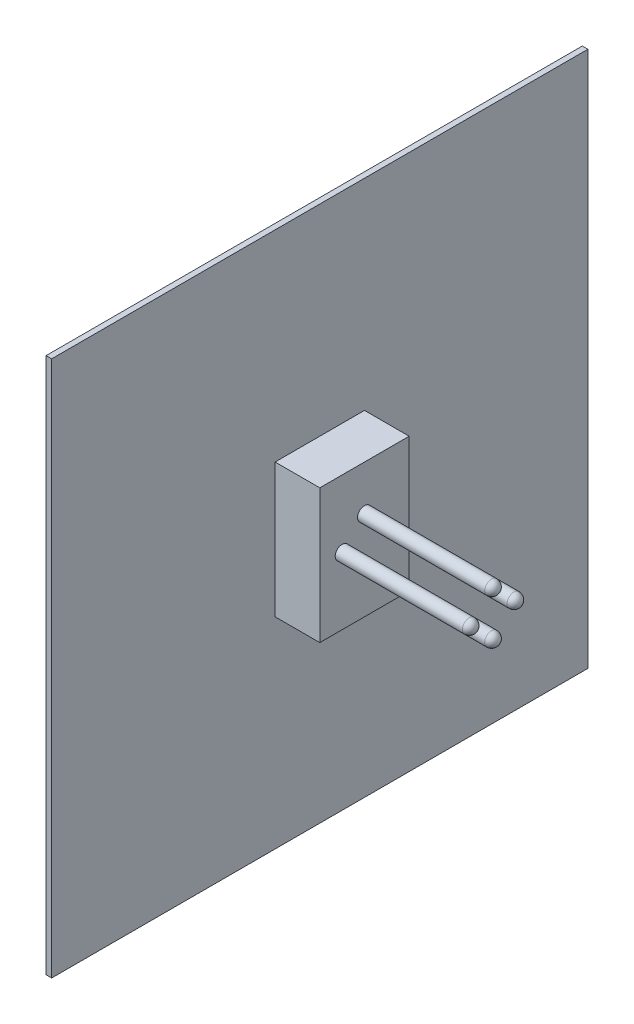
ISO-10303-21;
HEADER;
FILE_DESCRIPTION(('STEP AP214'),'2;1');
FILE_NAME('part.step','',(''),(''),'','','');
FILE_SCHEMA(('AUTOMOTIVE_DESIGN { 1 0 10303 214 1 1 1 1 }'));
ENDSEC;
DATA;
#1=APPLICATION_CONTEXT('core data for automotive mechanical design processes');
#2=APPLICATION_PROTOCOL_DEFINITION('international standard','automotive_design',2000,#1);
#3=PRODUCT_CONTEXT('',#1,'mechanical');
#4=PRODUCT('Part','Part','',(#3));
#5=PRODUCT_RELATED_PRODUCT_CATEGORY('part','',(#4));
#6=PRODUCT_DEFINITION_FORMATION('','',#4);
#7=PRODUCT_DEFINITION_CONTEXT('part definition',#1,'design');
#8=PRODUCT_DEFINITION('design','',#6,#7);
#9=PRODUCT_DEFINITION_SHAPE('','',#8);
#10=(LENGTH_UNIT() NAMED_UNIT(*) SI_UNIT(.MILLI.,.METRE.));
#11=(NAMED_UNIT(*) PLANE_ANGLE_UNIT() SI_UNIT($,.RADIAN.));
#12=(NAMED_UNIT(*) SI_UNIT($,.STERADIAN.) SOLID_ANGLE_UNIT());
#13=UNCERTAINTY_MEASURE_WITH_UNIT(LENGTH_MEASURE(1.E-05),#10,'distance_accuracy_value','');
#14=(GEOMETRIC_REPRESENTATION_CONTEXT(3) GLOBAL_UNCERTAINTY_ASSIGNED_CONTEXT((#13)) GLOBAL_UNIT_ASSIGNED_CONTEXT((#10,
#11,#12)) REPRESENTATION_CONTEXT('',''));
#15=CARTESIAN_POINT('',(0.,0.,0.));
#16=DIRECTION('',(0.,0.,1.));
#17=DIRECTION('',(1.,0.,0.));
#18=AXIS2_PLACEMENT_3D('',#15,#16,#17);
#19=CARTESIAN_POINT('',(3.175,0.,0.));
#20=DIRECTION('',(-1.,0.,0.));
#21=DIRECTION('',(0.,0.,1.));
#22=AXIS2_PLACEMENT_3D('',#19,#20,#21);
#23=PLANE('',#22);
#24=DIRECTION('',(0.,-1.,0.));
#25=VECTOR('',#24,1.);
#26=CARTESIAN_POINT('',(3.175,0.,0.));
#27=LINE('',#26,#25);
#28=CARTESIAN_POINT('',(3.175,304.8,0.));
#29=VERTEX_POINT('',#28);
#30=CARTESIAN_POINT('',(3.175,0.,0.));
#31=VERTEX_POINT('',#30);
#32=EDGE_CURVE('E141',#29,#31,#27,.T.);
#33=ORIENTED_EDGE('',*,*,#32,.T.);
#34=DIRECTION('',(0.,0.,-1.));
#35=VECTOR('',#34,1.);
#36=CARTESIAN_POINT('',(3.175,0.,0.));
#37=LINE('',#36,#35);
#38=CARTESIAN_POINT('',(3.175,0.,-304.8));
#39=VERTEX_POINT('',#38);
#40=EDGE_CURVE('E145',#31,#39,#37,.T.);
#41=ORIENTED_EDGE('',*,*,#40,.T.);
#42=DIRECTION('',(0.,1.,0.));
#43=VECTOR('',#42,1.);
#44=CARTESIAN_POINT('',(3.175,0.,-304.8));
#45=LINE('',#44,#43);
#46=CARTESIAN_POINT('',(3.175,304.8,-304.8));
#47=VERTEX_POINT('',#46);
#48=EDGE_CURVE('E149',#39,#47,#45,.T.);
#49=ORIENTED_EDGE('',*,*,#48,.T.);
#50=DIRECTION('',(0.,0.,1.));
#51=VECTOR('',#50,1.);
#52=CARTESIAN_POINT('',(3.175,304.8,0.));
#53=LINE('',#52,#51);
#54=EDGE_CURVE('E152',#47,#29,#53,.T.);
#55=ORIENTED_EDGE('',*,*,#54,.T.);
#56=EDGE_LOOP('',(#33,#41,#49,#55));
#57=FACE_BOUND('',#56,.T.);
#58=DIRECTION('',(0.,1.,0.));
#59=VECTOR('',#58,1.);
#60=CARTESIAN_POINT('',(3.175,190.5,-177.8));
#61=LINE('',#60,#59);
#62=CARTESIAN_POINT('',(3.175,114.3,-177.8));
#63=VERTEX_POINT('',#62);
#64=CARTESIAN_POINT('',(3.175,190.5,-177.8));
#65=VERTEX_POINT('',#64);
#66=EDGE_CURVE('E57',#63,#65,#61,.T.);
#67=ORIENTED_EDGE('',*,*,#66,.F.);
#68=DIRECTION('',(0.,0.,-1.));
#69=VECTOR('',#68,1.);
#70=CARTESIAN_POINT('',(3.175,114.3,-127.));
#71=LINE('',#70,#69);
#72=CARTESIAN_POINT('',(3.175,114.3,-127.));
#73=VERTEX_POINT('',#72);
#74=EDGE_CURVE('E61',#73,#63,#71,.T.);
#75=ORIENTED_EDGE('',*,*,#74,.F.);
#76=DIRECTION('',(0.,-1.,0.));
#77=VECTOR('',#76,1.);
#78=CARTESIAN_POINT('',(3.175,190.5,-127.));
#79=LINE('',#78,#77);
#80=CARTESIAN_POINT('',(3.175,190.5,-127.));
#81=VERTEX_POINT('',#80);
#82=EDGE_CURVE('E269',#81,#73,#79,.T.);
#83=ORIENTED_EDGE('',*,*,#82,.F.);
#84=DIRECTION('',(0.,0.,1.));
#85=VECTOR('',#84,1.);
#86=CARTESIAN_POINT('',(3.175,190.5,-127.));
#87=LINE('',#86,#85);
#88=EDGE_CURVE('E255',#65,#81,#87,.T.);
#89=ORIENTED_EDGE('',*,*,#88,.F.);
#90=EDGE_LOOP('',(#67,#75,#83,#89));
#91=FACE_BOUND('',#90,.T.);
#92=ADVANCED_FACE('F41',(#57,#91),#23,.F.);
#93=CARTESIAN_POINT('',(3.175,0.,0.));
#94=DIRECTION('',(0.,0.,-1.));
#95=DIRECTION('',(-1.,0.,0.));
#96=AXIS2_PLACEMENT_3D('',#93,#94,#95);
#97=PLANE('',#96);
#98=DIRECTION('',(0.,-1.,0.));
#99=VECTOR('',#98,1.);
#100=CARTESIAN_POINT('',(0.,0.,0.));
#101=LINE('',#100,#99);
#102=CARTESIAN_POINT('',(0.,304.8,0.));
#103=VERTEX_POINT('',#102);
#104=CARTESIAN_POINT('',(0.,0.,0.));
#105=VERTEX_POINT('',#104);
#106=EDGE_CURVE('E130',#103,#105,#101,.T.);
#107=ORIENTED_EDGE('',*,*,#106,.T.);
#108=DIRECTION('',(-1.,0.,0.));
#109=VECTOR('',#108,1.);
#110=CARTESIAN_POINT('',(3.175,0.,0.));
#111=LINE('',#110,#109);
#112=EDGE_CURVE('E174',#31,#105,#111,.T.);
#113=ORIENTED_EDGE('',*,*,#112,.F.);
#114=ORIENTED_EDGE('',*,*,#32,.F.);
#115=DIRECTION('',(-1.,0.,0.));
#116=VECTOR('',#115,1.);
#117=CARTESIAN_POINT('',(3.175,304.8,0.));
#118=LINE('',#117,#116);
#119=EDGE_CURVE('E154',#29,#103,#118,.T.);
#120=ORIENTED_EDGE('',*,*,#119,.T.);
#121=EDGE_LOOP('',(#107,#113,#114,#120));
#122=FACE_BOUND('',#121,.T.);
#123=ADVANCED_FACE('F204',(#122),#97,.F.);
#124=CARTESIAN_POINT('',(3.175,0.,0.));
#125=DIRECTION('',(0.,1.,0.));
#126=DIRECTION('',(0.,0.,1.));
#127=AXIS2_PLACEMENT_3D('',#124,#125,#126);
#128=PLANE('',#127);
#129=DIRECTION('',(0.,0.,-1.));
#130=VECTOR('',#129,1.);
#131=CARTESIAN_POINT('',(0.,0.,0.));
#132=LINE('',#131,#130);
#133=CARTESIAN_POINT('',(0.,0.,-304.8));
#134=VERTEX_POINT('',#133);
#135=EDGE_CURVE('E135',#105,#134,#132,.T.);
#136=ORIENTED_EDGE('',*,*,#135,.T.);
#137=DIRECTION('',(-1.,0.,0.));
#138=VECTOR('',#137,1.);
#139=CARTESIAN_POINT('',(3.175,0.,-304.8));
#140=LINE('',#139,#138);
#141=EDGE_CURVE('E170',#39,#134,#140,.T.);
#142=ORIENTED_EDGE('',*,*,#141,.F.);
#143=ORIENTED_EDGE('',*,*,#40,.F.);
#144=ORIENTED_EDGE('',*,*,#112,.T.);
#145=EDGE_LOOP('',(#136,#142,#143,#144));
#146=FACE_BOUND('',#145,.T.);
#147=ADVANCED_FACE('F210',(#146),#128,.F.);
#148=CARTESIAN_POINT('',(3.175,0.,-304.8));
#149=DIRECTION('',(0.,0.,1.));
#150=DIRECTION('',(1.,0.,0.));
#151=AXIS2_PLACEMENT_3D('',#148,#149,#150);
#152=PLANE('',#151);
#153=DIRECTION('',(0.,1.,0.));
#154=VECTOR('',#153,1.);
#155=CARTESIAN_POINT('',(0.,0.,-304.8));
#156=LINE('',#155,#154);
#157=CARTESIAN_POINT('',(0.,304.8,-304.8));
#158=VERTEX_POINT('',#157);
#159=EDGE_CURVE('E158',#134,#158,#156,.T.);
#160=ORIENTED_EDGE('',*,*,#159,.T.);
#161=DIRECTION('',(-1.,0.,0.));
#162=VECTOR('',#161,1.);
#163=CARTESIAN_POINT('',(3.175,304.8,-304.8));
#164=LINE('',#163,#162);
#165=EDGE_CURVE('E166',#47,#158,#164,.T.);
#166=ORIENTED_EDGE('',*,*,#165,.F.);
#167=ORIENTED_EDGE('',*,*,#48,.F.);
#168=ORIENTED_EDGE('',*,*,#141,.T.);
#169=EDGE_LOOP('',(#160,#166,#167,#168));
#170=FACE_BOUND('',#169,.T.);
#171=ADVANCED_FACE('F223',(#170),#152,.F.);
#172=CARTESIAN_POINT('',(3.175,304.8,0.));
#173=DIRECTION('',(0.,-1.,0.));
#174=DIRECTION('',(0.,0.,-1.));
#175=AXIS2_PLACEMENT_3D('',#172,#173,#174);
#176=PLANE('',#175);
#177=DIRECTION('',(0.,0.,1.));
#178=VECTOR('',#177,1.);
#179=CARTESIAN_POINT('',(0.,304.8,0.));
#180=LINE('',#179,#178);
#181=EDGE_CURVE('E146',#158,#103,#180,.T.);
#182=ORIENTED_EDGE('',*,*,#181,.T.);
#183=ORIENTED_EDGE('',*,*,#119,.F.);
#184=ORIENTED_EDGE('',*,*,#54,.F.);
#185=ORIENTED_EDGE('',*,*,#165,.T.);
#186=EDGE_LOOP('',(#182,#183,#184,#185));
#187=FACE_BOUND('',#186,.T.);
#188=ADVANCED_FACE('F219',(#187),#176,.F.);
#189=CARTESIAN_POINT('',(0.,0.,0.));
#190=DIRECTION('',(-1.,0.,0.));
#191=DIRECTION('',(0.,0.,1.));
#192=AXIS2_PLACEMENT_3D('',#189,#190,#191);
#193=PLANE('',#192);
#194=ORIENTED_EDGE('',*,*,#106,.F.);
#195=ORIENTED_EDGE('',*,*,#181,.F.);
#196=ORIENTED_EDGE('',*,*,#159,.F.);
#197=ORIENTED_EDGE('',*,*,#135,.F.);
#198=EDGE_LOOP('',(#194,#195,#196,#197));
#199=FACE_BOUND('',#198,.T.);
#200=ADVANCED_FACE('F216',(#199),#193,.T.);
#201=CARTESIAN_POINT('',(28.575,190.5,-177.8));
#202=DIRECTION('',(0.,0.,1.));
#203=DIRECTION('',(1.,0.,0.));
#204=AXIS2_PLACEMENT_3D('',#201,#202,#203);
#205=PLANE('',#204);
#206=ORIENTED_EDGE('',*,*,#66,.T.);
#207=DIRECTION('',(-1.,0.,0.));
#208=VECTOR('',#207,1.);
#209=CARTESIAN_POINT('',(28.575,190.5,-177.8));
#210=LINE('',#209,#208);
#211=CARTESIAN_POINT('',(28.575,190.5,-177.8));
#212=VERTEX_POINT('',#211);
#213=EDGE_CURVE('E110',#212,#65,#210,.T.);
#214=ORIENTED_EDGE('',*,*,#213,.F.);
#215=DIRECTION('',(0.,1.,0.));
#216=VECTOR('',#215,1.);
#217=CARTESIAN_POINT('',(28.575,190.5,-177.8));
#218=LINE('',#217,#216);
#219=CARTESIAN_POINT('',(28.575,114.3,-177.8));
#220=VERTEX_POINT('',#219);
#221=EDGE_CURVE('E117',#220,#212,#218,.T.);
#222=ORIENTED_EDGE('',*,*,#221,.F.);
#223=DIRECTION('',(-1.,0.,0.));
#224=VECTOR('',#223,1.);
#225=CARTESIAN_POINT('',(28.575,114.3,-177.8));
#226=LINE('',#225,#224);
#227=EDGE_CURVE('E265',#220,#63,#226,.T.);
#228=ORIENTED_EDGE('',*,*,#227,.T.);
#229=EDGE_LOOP('',(#206,#214,#222,#228));
#230=FACE_BOUND('',#229,.T.);
#231=ADVANCED_FACE('F128',(#230),#205,.F.);
#232=CARTESIAN_POINT('',(28.575,190.5,-127.));
#233=DIRECTION('',(0.,-1.,0.));
#234=DIRECTION('',(0.,0.,-1.));
#235=AXIS2_PLACEMENT_3D('',#232,#233,#234);
#236=PLANE('',#235);
#237=ORIENTED_EDGE('',*,*,#88,.T.);
#238=DIRECTION('',(-1.,0.,0.));
#239=VECTOR('',#238,1.);
#240=CARTESIAN_POINT('',(28.575,190.5,-127.));
#241=LINE('',#240,#239);
#242=CARTESIAN_POINT('',(28.575,190.5,-127.));
#243=VERTEX_POINT('',#242);
#244=EDGE_CURVE('E112',#243,#81,#241,.T.);
#245=ORIENTED_EDGE('',*,*,#244,.F.);
#246=DIRECTION('',(0.,0.,1.));
#247=VECTOR('',#246,1.);
#248=CARTESIAN_POINT('',(28.575,190.5,-127.));
#249=LINE('',#248,#247);
#250=EDGE_CURVE('E105',#212,#243,#249,.T.);
#251=ORIENTED_EDGE('',*,*,#250,.F.);
#252=ORIENTED_EDGE('',*,*,#213,.T.);
#253=EDGE_LOOP('',(#237,#245,#251,#252));
#254=FACE_BOUND('',#253,.T.);
#255=ADVANCED_FACE('F108',(#254),#236,.F.);
#256=CARTESIAN_POINT('',(28.575,190.5,-127.));
#257=DIRECTION('',(0.,0.,-1.));
#258=DIRECTION('',(0.,1.,0.));
#259=AXIS2_PLACEMENT_3D('',#256,#257,#258);
#260=PLANE('',#259);
#261=ORIENTED_EDGE('',*,*,#82,.T.);
#262=DIRECTION('',(-1.,0.,0.));
#263=VECTOR('',#262,1.);
#264=CARTESIAN_POINT('',(28.575,114.3,-127.));
#265=LINE('',#264,#263);
#266=CARTESIAN_POINT('',(28.575,114.3,-127.));
#267=VERTEX_POINT('',#266);
#268=EDGE_CURVE('E137',#267,#73,#265,.T.);
#269=ORIENTED_EDGE('',*,*,#268,.F.);
#270=DIRECTION('',(0.,-1.,0.));
#271=VECTOR('',#270,1.);
#272=CARTESIAN_POINT('',(28.575,190.5,-127.));
#273=LINE('',#272,#271);
#274=EDGE_CURVE('E116',#243,#267,#273,.T.);
#275=ORIENTED_EDGE('',*,*,#274,.F.);
#276=ORIENTED_EDGE('',*,*,#244,.T.);
#277=EDGE_LOOP('',(#261,#269,#275,#276));
#278=FACE_BOUND('',#277,.T.);
#279=ADVANCED_FACE('F281',(#278),#260,.F.);
#280=CARTESIAN_POINT('',(28.575,114.3,-127.));
#281=DIRECTION('',(0.,1.,0.));
#282=DIRECTION('',(0.,0.,1.));
#283=AXIS2_PLACEMENT_3D('',#280,#281,#282);
#284=PLANE('',#283);
#285=ORIENTED_EDGE('',*,*,#74,.T.);
#286=ORIENTED_EDGE('',*,*,#227,.F.);
#287=DIRECTION('',(0.,0.,-1.));
#288=VECTOR('',#287,1.);
#289=CARTESIAN_POINT('',(28.575,114.3,-127.));
#290=LINE('',#289,#288);
#291=EDGE_CURVE('E122',#267,#220,#290,.T.);
#292=ORIENTED_EDGE('',*,*,#291,.F.);
#293=ORIENTED_EDGE('',*,*,#268,.T.);
#294=EDGE_LOOP('',(#285,#286,#292,#293));
#295=FACE_BOUND('',#294,.T.);
#296=ADVANCED_FACE('F279',(#295),#284,.F.);
#297=CARTESIAN_POINT('',(28.575,0.,0.));
#298=DIRECTION('',(1.,0.,0.));
#299=DIRECTION('',(0.,0.,-1.));
#300=AXIS2_PLACEMENT_3D('',#297,#298,#299);
#301=PLANE('',#300);
#302=CARTESIAN_POINT('',(28.575,152.4,-139.7));
#303=DIRECTION('',(1.,0.,0.));
#304=DIRECTION('',(0.,0.,-1.));
#305=AXIS2_PLACEMENT_3D('',#302,#303,#304);
#306=CIRCLE('',#305,3.937);
#307=CARTESIAN_POINT('',(28.575,152.4,-135.763));
#308=VERTEX_POINT('',#307);
#309=EDGE_CURVE('E411',#308,#308,#306,.T.);
#310=ORIENTED_EDGE('',*,*,#309,.F.);
#311=EDGE_LOOP('',(#310));
#312=FACE_BOUND('',#311,.T.);
#313=CARTESIAN_POINT('',(28.575,165.1,-152.4));
#314=DIRECTION('',(1.,0.,0.));
#315=DIRECTION('',(0.,0.,-1.));
#316=AXIS2_PLACEMENT_3D('',#313,#314,#315);
#317=CIRCLE('',#316,3.937);
#318=CARTESIAN_POINT('',(28.575,165.1,-148.463));
#319=VERTEX_POINT('',#318);
#320=EDGE_CURVE('E258',#319,#319,#317,.T.);
#321=ORIENTED_EDGE('',*,*,#320,.F.);
#322=EDGE_LOOP('',(#321));
#323=FACE_BOUND('',#322,.T.);
#324=CARTESIAN_POINT('',(28.575,152.4,-165.1));
#325=DIRECTION('',(1.,0.,0.));
#326=DIRECTION('',(0.,0.,-1.));
#327=AXIS2_PLACEMENT_3D('',#324,#325,#326);
#328=CIRCLE('',#327,3.937);
#329=CARTESIAN_POINT('',(28.575,152.4,-161.163));
#330=VERTEX_POINT('',#329);
#331=EDGE_CURVE('E251',#330,#330,#328,.T.);
#332=ORIENTED_EDGE('',*,*,#331,.F.);
#333=EDGE_LOOP('',(#332));
#334=FACE_BOUND('',#333,.T.);
#335=CARTESIAN_POINT('',(28.575,139.7,-152.4));
#336=DIRECTION('',(1.,0.,0.));
#337=DIRECTION('',(0.,0.,-1.));
#338=AXIS2_PLACEMENT_3D('',#335,#336,#337);
#339=CIRCLE('',#338,3.937);
#340=CARTESIAN_POINT('',(28.575,139.7,-148.463));
#341=VERTEX_POINT('',#340);
#342=EDGE_CURVE('E248',#341,#341,#339,.T.);
#343=ORIENTED_EDGE('',*,*,#342,.F.);
#344=EDGE_LOOP('',(#343));
#345=FACE_BOUND('',#344,.T.);
#346=ORIENTED_EDGE('',*,*,#221,.T.);
#347=ORIENTED_EDGE('',*,*,#250,.T.);
#348=ORIENTED_EDGE('',*,*,#274,.T.);
#349=ORIENTED_EDGE('',*,*,#291,.T.);
#350=EDGE_LOOP('',(#346,#347,#348,#349));
#351=FACE_BOUND('',#350,.T.);
#352=ADVANCED_FACE('F120',(#312,#323,#334,#345,#351),#301,.T.);
#353=CARTESIAN_POINT('',(104.775,139.7,-152.4));
#354=DIRECTION('',(-1.,0.,0.));
#355=DIRECTION('',(0.,0.,1.));
#356=AXIS2_PLACEMENT_3D('',#353,#354,#355);
#357=CYLINDRICAL_SURFACE('',#356,3.937);
#358=CARTESIAN_POINT('',(100.838,139.7,-152.4));
#359=DIRECTION('',(-1.,0.,0.));
#360=DIRECTION('',(0.,0.,1.));
#361=AXIS2_PLACEMENT_3D('',#358,#359,#360);
#362=CIRCLE('',#361,3.937);
#363=CARTESIAN_POINT('',(100.838,139.7,-148.463));
#364=VERTEX_POINT('',#363);
#365=EDGE_CURVE('E178',#364,#364,#362,.T.);
#366=CARTESIAN_POINT('',(100.838,139.7,-148.463));
#367=CARTESIAN_POINT('',(100.085260416667,139.7,-148.463));
#368=CARTESIAN_POINT('',(99.3325208333333,139.7,-148.463));
#369=CARTESIAN_POINT('',(97.8270416666667,139.7,-148.463));
#370=CARTESIAN_POINT('',(97.0743020833333,139.7,-148.463));
#371=CARTESIAN_POINT('',(95.5688229166667,139.7,-148.463));
#372=CARTESIAN_POINT('',(94.8160833333333,139.7,-148.463));
#373=CARTESIAN_POINT('',(93.3106041666667,139.7,-148.463));
#374=CARTESIAN_POINT('',(92.5578645833333,139.7,-148.463));
#375=CARTESIAN_POINT('',(91.0523854166667,139.7,-148.463));
#376=CARTESIAN_POINT('',(90.2996458333333,139.7,-148.463));
#377=CARTESIAN_POINT('',(88.7941666666667,139.7,-148.463));
#378=CARTESIAN_POINT('',(88.0414270833333,139.7,-148.463));
#379=CARTESIAN_POINT('',(86.5359479166667,139.7,-148.463));
#380=CARTESIAN_POINT('',(85.7832083333333,139.7,-148.463));
#381=CARTESIAN_POINT('',(84.2777291666667,139.7,-148.463));
#382=CARTESIAN_POINT('',(83.5249895833334,139.7,-148.463));
#383=CARTESIAN_POINT('',(82.0195104166667,139.7,-148.463));
#384=CARTESIAN_POINT('',(81.2667708333334,139.7,-148.463));
#385=CARTESIAN_POINT('',(79.7612916666667,139.7,-148.463));
#386=CARTESIAN_POINT('',(79.0085520833334,139.7,-148.463));
#387=CARTESIAN_POINT('',(77.5030729166667,139.7,-148.463));
#388=CARTESIAN_POINT('',(76.7503333333333,139.7,-148.463));
#389=CARTESIAN_POINT('',(75.2448541666667,139.7,-148.463));
#390=CARTESIAN_POINT('',(74.4921145833333,139.7,-148.463));
#391=CARTESIAN_POINT('',(72.9866354166667,139.7,-148.463));
#392=CARTESIAN_POINT('',(72.2338958333333,139.7,-148.463));
#393=CARTESIAN_POINT('',(70.7284166666667,139.7,-148.463));
#394=CARTESIAN_POINT('',(69.9756770833333,139.7,-148.463));
#395=CARTESIAN_POINT('',(68.4701979166667,139.7,-148.463));
#396=CARTESIAN_POINT('',(67.7174583333333,139.7,-148.463));
#397=CARTESIAN_POINT('',(66.2119791666667,139.7,-148.463));
#398=CARTESIAN_POINT('',(65.4592395833333,139.7,-148.463));
#399=CARTESIAN_POINT('',(63.9537604166667,139.7,-148.463));
#400=CARTESIAN_POINT('',(63.2010208333333,139.7,-148.463));
#401=CARTESIAN_POINT('',(61.6955416666667,139.7,-148.463));
#402=CARTESIAN_POINT('',(60.9428020833334,139.7,-148.463));
#403=CARTESIAN_POINT('',(59.4373229166667,139.7,-148.463));
#404=CARTESIAN_POINT('',(58.6845833333333,139.7,-148.463));
#405=CARTESIAN_POINT('',(57.1791041666667,139.7,-148.463));
#406=CARTESIAN_POINT('',(56.4263645833333,139.7,-148.463));
#407=CARTESIAN_POINT('',(54.9208854166667,139.7,-148.463));
#408=CARTESIAN_POINT('',(54.1681458333333,139.7,-148.463));
#409=CARTESIAN_POINT('',(52.6626666666667,139.7,-148.463));
#410=CARTESIAN_POINT('',(51.9099270833333,139.7,-148.463));
#411=CARTESIAN_POINT('',(50.4044479166667,139.7,-148.463));
#412=CARTESIAN_POINT('',(49.6517083333333,139.7,-148.463));
#413=CARTESIAN_POINT('',(48.1462291666667,139.7,-148.463));
#414=CARTESIAN_POINT('',(47.3934895833333,139.7,-148.463));
#415=CARTESIAN_POINT('',(45.8880104166667,139.7,-148.463));
#416=CARTESIAN_POINT('',(45.1352708333333,139.7,-148.463));
#417=CARTESIAN_POINT('',(43.6297916666667,139.7,-148.463));
#418=CARTESIAN_POINT('',(42.8770520833334,139.7,-148.463));
#419=CARTESIAN_POINT('',(41.3715729166667,139.7,-148.463));
#420=CARTESIAN_POINT('',(40.6188333333333,139.7,-148.463));
#421=CARTESIAN_POINT('',(39.1133541666667,139.7,-148.463));
#422=CARTESIAN_POINT('',(38.3606145833333,139.7,-148.463));
#423=CARTESIAN_POINT('',(36.8551354166667,139.7,-148.463));
#424=CARTESIAN_POINT('',(36.1023958333333,139.7,-148.463));
#425=CARTESIAN_POINT('',(34.5969166666667,139.7,-148.463));
#426=CARTESIAN_POINT('',(33.8441770833333,139.7,-148.463));
#427=CARTESIAN_POINT('',(32.3386979166667,139.7,-148.463));
#428=CARTESIAN_POINT('',(31.5859583333333,139.7,-148.463));
#429=CARTESIAN_POINT('',(30.0804791666667,139.7,-148.463));
#430=CARTESIAN_POINT('',(29.3277395833333,139.7,-148.463));
#431=CARTESIAN_POINT('',(28.575,139.7,-148.463));
#432=B_SPLINE_CURVE_WITH_KNOTS('',3,(#366,#367,#368,#369,#370,#371,#372,#373,#374,#375,#376,
#377,#378,#379,#380,#381,#382,#383,#384,#385,#386,#387,#388,#389,#390,#391,#392,#393,#394,#395,
#396,#397,#398,#399,#400,#401,#402,#403,#404,#405,#406,#407,#408,#409,#410,#411,#412,#413,#414,
#415,#416,#417,#418,#419,#420,#421,#422,#423,#424,#425,#426,#427,#428,#429,#430,#431),
.UNSPECIFIED.,.F.,.F.,(4,2,2,2,2,2,2,2,2,2,2,2,2,2,2,2,2,2,2,2,2,2,2,2,2,2,2,2,2,2,2,2,4),(0.,
2.25821875000001,4.51643750000001,6.77465625000001,9.03287500000001,11.29109375,13.5493125,
15.80753125,18.06575,20.32396875,22.5821875,24.84040625,27.098625,29.35684375,31.6150625,
33.87328125,36.1315,38.38971875,40.6479375,42.90615625,45.164375,47.42259375,49.6808125,
51.93903125,54.19725,56.45546875,58.7136875,60.97190625,63.230125,65.48834375,67.7465625,
70.00478125,72.263),.UNSPECIFIED.);
#433=EDGE_CURVE('BSEAM241',#364,#341,#432,.T.);
#434=ORIENTED_EDGE('',*,*,#365,.T.);
#435=ORIENTED_EDGE('',*,*,#342,.T.);
#436=ORIENTED_EDGE('',*,*,#433,.T.);
#437=ORIENTED_EDGE('',*,*,#433,.F.);
#438=EDGE_LOOP('',(#434,#436,#435,#437));
#439=FACE_BOUND('',#438,.T.);
#440=ADVANCED_FACE('F241',(#439),#357,.T.);
#441=CARTESIAN_POINT('',(104.775,152.4,-165.1));
#442=DIRECTION('',(-1.,0.,0.));
#443=DIRECTION('',(0.,0.,1.));
#444=AXIS2_PLACEMENT_3D('',#441,#442,#443);
#445=CYLINDRICAL_SURFACE('',#444,3.937);
#446=CARTESIAN_POINT('',(100.838,152.4,-165.1));
#447=DIRECTION('',(-1.,0.,0.));
#448=DIRECTION('',(0.,0.,1.));
#449=AXIS2_PLACEMENT_3D('',#446,#447,#448);
#450=CIRCLE('',#449,3.937);
#451=CARTESIAN_POINT('',(100.838,152.4,-161.163));
#452=VERTEX_POINT('',#451);
#453=EDGE_CURVE('E11',#452,#452,#450,.T.);
#454=CARTESIAN_POINT('',(100.838,152.4,-161.163));
#455=CARTESIAN_POINT('',(100.085260416667,152.4,-161.163));
#456=CARTESIAN_POINT('',(99.3325208333333,152.4,-161.163));
#457=CARTESIAN_POINT('',(97.8270416666667,152.4,-161.163));
#458=CARTESIAN_POINT('',(97.0743020833333,152.4,-161.163));
#459=CARTESIAN_POINT('',(95.5688229166667,152.4,-161.163));
#460=CARTESIAN_POINT('',(94.8160833333333,152.4,-161.163));
#461=CARTESIAN_POINT('',(93.3106041666667,152.4,-161.163));
#462=CARTESIAN_POINT('',(92.5578645833333,152.4,-161.163));
#463=CARTESIAN_POINT('',(91.0523854166667,152.4,-161.163));
#464=CARTESIAN_POINT('',(90.2996458333333,152.4,-161.163));
#465=CARTESIAN_POINT('',(88.7941666666667,152.4,-161.163));
#466=CARTESIAN_POINT('',(88.0414270833333,152.4,-161.163));
#467=CARTESIAN_POINT('',(86.5359479166667,152.4,-161.163));
#468=CARTESIAN_POINT('',(85.7832083333333,152.4,-161.163));
#469=CARTESIAN_POINT('',(84.2777291666667,152.4,-161.163));
#470=CARTESIAN_POINT('',(83.5249895833334,152.4,-161.163));
#471=CARTESIAN_POINT('',(82.0195104166667,152.4,-161.163));
#472=CARTESIAN_POINT('',(81.2667708333334,152.4,-161.163));
#473=CARTESIAN_POINT('',(79.7612916666667,152.4,-161.163));
#474=CARTESIAN_POINT('',(79.0085520833334,152.4,-161.163));
#475=CARTESIAN_POINT('',(77.5030729166667,152.4,-161.163));
#476=CARTESIAN_POINT('',(76.7503333333333,152.4,-161.163));
#477=CARTESIAN_POINT('',(75.2448541666667,152.4,-161.163));
#478=CARTESIAN_POINT('',(74.4921145833333,152.4,-161.163));
#479=CARTESIAN_POINT('',(72.9866354166667,152.4,-161.163));
#480=CARTESIAN_POINT('',(72.2338958333333,152.4,-161.163));
#481=CARTESIAN_POINT('',(70.7284166666667,152.4,-161.163));
#482=CARTESIAN_POINT('',(69.9756770833333,152.4,-161.163));
#483=CARTESIAN_POINT('',(68.4701979166667,152.4,-161.163));
#484=CARTESIAN_POINT('',(67.7174583333333,152.4,-161.163));
#485=CARTESIAN_POINT('',(66.2119791666667,152.4,-161.163));
#486=CARTESIAN_POINT('',(65.4592395833333,152.4,-161.163));
#487=CARTESIAN_POINT('',(63.9537604166667,152.4,-161.163));
#488=CARTESIAN_POINT('',(63.2010208333333,152.4,-161.163));
#489=CARTESIAN_POINT('',(61.6955416666667,152.4,-161.163));
#490=CARTESIAN_POINT('',(60.9428020833334,152.4,-161.163));
#491=CARTESIAN_POINT('',(59.4373229166667,152.4,-161.163));
#492=CARTESIAN_POINT('',(58.6845833333333,152.4,-161.163));
#493=CARTESIAN_POINT('',(57.1791041666667,152.4,-161.163));
#494=CARTESIAN_POINT('',(56.4263645833333,152.4,-161.163));
#495=CARTESIAN_POINT('',(54.9208854166667,152.4,-161.163));
#496=CARTESIAN_POINT('',(54.1681458333333,152.4,-161.163));
#497=CARTESIAN_POINT('',(52.6626666666667,152.4,-161.163));
#498=CARTESIAN_POINT('',(51.9099270833333,152.4,-161.163));
#499=CARTESIAN_POINT('',(50.4044479166667,152.4,-161.163));
#500=CARTESIAN_POINT('',(49.6517083333333,152.4,-161.163));
#501=CARTESIAN_POINT('',(48.1462291666667,152.4,-161.163));
#502=CARTESIAN_POINT('',(47.3934895833333,152.4,-161.163));
#503=CARTESIAN_POINT('',(45.8880104166667,152.4,-161.163));
#504=CARTESIAN_POINT('',(45.1352708333333,152.4,-161.163));
#505=CARTESIAN_POINT('',(43.6297916666667,152.4,-161.163));
#506=CARTESIAN_POINT('',(42.8770520833334,152.4,-161.163));
#507=CARTESIAN_POINT('',(41.3715729166667,152.4,-161.163));
#508=CARTESIAN_POINT('',(40.6188333333333,152.4,-161.163));
#509=CARTESIAN_POINT('',(39.1133541666667,152.4,-161.163));
#510=CARTESIAN_POINT('',(38.3606145833333,152.4,-161.163));
#511=CARTESIAN_POINT('',(36.8551354166667,152.4,-161.163));
#512=CARTESIAN_POINT('',(36.1023958333333,152.4,-161.163));
#513=CARTESIAN_POINT('',(34.5969166666667,152.4,-161.163));
#514=CARTESIAN_POINT('',(33.8441770833333,152.4,-161.163));
#515=CARTESIAN_POINT('',(32.3386979166667,152.4,-161.163));
#516=CARTESIAN_POINT('',(31.5859583333333,152.4,-161.163));
#517=CARTESIAN_POINT('',(30.0804791666667,152.4,-161.163));
#518=CARTESIAN_POINT('',(29.3277395833333,152.4,-161.163));
#519=CARTESIAN_POINT('',(28.575,152.4,-161.163));
#520=B_SPLINE_CURVE_WITH_KNOTS('',3,(#454,#455,#456,#457,#458,#459,#460,#461,#462,#463,#464,
#465,#466,#467,#468,#469,#470,#471,#472,#473,#474,#475,#476,#477,#478,#479,#480,#481,#482,#483,
#484,#485,#486,#487,#488,#489,#490,#491,#492,#493,#494,#495,#496,#497,#498,#499,#500,#501,#502,
#503,#504,#505,#506,#507,#508,#509,#510,#511,#512,#513,#514,#515,#516,#517,#518,#519),
.UNSPECIFIED.,.F.,.F.,(4,2,2,2,2,2,2,2,2,2,2,2,2,2,2,2,2,2,2,2,2,2,2,2,2,2,2,2,2,2,2,2,4),(0.,
2.25821875000001,4.51643750000001,6.77465625000001,9.03287500000001,11.29109375,13.5493125,
15.80753125,18.06575,20.32396875,22.5821875,24.84040625,27.098625,29.35684375,31.6150625,
33.87328125,36.1315,38.38971875,40.6479375,42.90615625,45.164375,47.42259375,49.6808125,
51.93903125,54.19725,56.45546875,58.7136875,60.97190625,63.230125,65.48834375,67.7465625,
70.00478125,72.263),.UNSPECIFIED.);
#521=EDGE_CURVE('BSEAM244',#452,#330,#520,.T.);
#522=ORIENTED_EDGE('',*,*,#453,.T.);
#523=ORIENTED_EDGE('',*,*,#331,.T.);
#524=ORIENTED_EDGE('',*,*,#521,.T.);
#525=ORIENTED_EDGE('',*,*,#521,.F.);
#526=EDGE_LOOP('',(#522,#524,#523,#525));
#527=FACE_BOUND('',#526,.T.);
#528=ADVANCED_FACE('F244',(#527),#445,.T.);
#529=CARTESIAN_POINT('',(104.775,165.1,-152.4));
#530=DIRECTION('',(-1.,0.,0.));
#531=DIRECTION('',(0.,0.,1.));
#532=AXIS2_PLACEMENT_3D('',#529,#530,#531);
#533=CYLINDRICAL_SURFACE('',#532,3.937);
#534=CARTESIAN_POINT('',(100.838,165.1,-152.4));
#535=DIRECTION('',(-1.,0.,0.));
#536=DIRECTION('',(0.,0.,1.));
#537=AXIS2_PLACEMENT_3D('',#534,#535,#536);
#538=CIRCLE('',#537,3.937);
#539=CARTESIAN_POINT('',(100.838,165.1,-148.463));
#540=VERTEX_POINT('',#539);
#541=EDGE_CURVE('E50',#540,#540,#538,.T.);
#542=CARTESIAN_POINT('',(100.838,165.1,-148.463));
#543=CARTESIAN_POINT('',(100.085260416667,165.1,-148.463));
#544=CARTESIAN_POINT('',(99.3325208333333,165.1,-148.463));
#545=CARTESIAN_POINT('',(97.8270416666667,165.1,-148.463));
#546=CARTESIAN_POINT('',(97.0743020833333,165.1,-148.463));
#547=CARTESIAN_POINT('',(95.5688229166667,165.1,-148.463));
#548=CARTESIAN_POINT('',(94.8160833333333,165.1,-148.463));
#549=CARTESIAN_POINT('',(93.3106041666667,165.1,-148.463));
#550=CARTESIAN_POINT('',(92.5578645833333,165.1,-148.463));
#551=CARTESIAN_POINT('',(91.0523854166667,165.1,-148.463));
#552=CARTESIAN_POINT('',(90.2996458333333,165.1,-148.463));
#553=CARTESIAN_POINT('',(88.7941666666667,165.1,-148.463));
#554=CARTESIAN_POINT('',(88.0414270833333,165.1,-148.463));
#555=CARTESIAN_POINT('',(86.5359479166667,165.1,-148.463));
#556=CARTESIAN_POINT('',(85.7832083333333,165.1,-148.463));
#557=CARTESIAN_POINT('',(84.2777291666667,165.1,-148.463));
#558=CARTESIAN_POINT('',(83.5249895833334,165.1,-148.463));
#559=CARTESIAN_POINT('',(82.0195104166667,165.1,-148.463));
#560=CARTESIAN_POINT('',(81.2667708333334,165.1,-148.463));
#561=CARTESIAN_POINT('',(79.7612916666667,165.1,-148.463));
#562=CARTESIAN_POINT('',(79.0085520833334,165.1,-148.463));
#563=CARTESIAN_POINT('',(77.5030729166667,165.1,-148.463));
#564=CARTESIAN_POINT('',(76.7503333333333,165.1,-148.463));
#565=CARTESIAN_POINT('',(75.2448541666667,165.1,-148.463));
#566=CARTESIAN_POINT('',(74.4921145833333,165.1,-148.463));
#567=CARTESIAN_POINT('',(72.9866354166667,165.1,-148.463));
#568=CARTESIAN_POINT('',(72.2338958333333,165.1,-148.463));
#569=CARTESIAN_POINT('',(70.7284166666667,165.1,-148.463));
#570=CARTESIAN_POINT('',(69.9756770833333,165.1,-148.463));
#571=CARTESIAN_POINT('',(68.4701979166667,165.1,-148.463));
#572=CARTESIAN_POINT('',(67.7174583333333,165.1,-148.463));
#573=CARTESIAN_POINT('',(66.2119791666667,165.1,-148.463));
#574=CARTESIAN_POINT('',(65.4592395833333,165.1,-148.463));
#575=CARTESIAN_POINT('',(63.9537604166667,165.1,-148.463));
#576=CARTESIAN_POINT('',(63.2010208333333,165.1,-148.463));
#577=CARTESIAN_POINT('',(61.6955416666667,165.1,-148.463));
#578=CARTESIAN_POINT('',(60.9428020833334,165.1,-148.463));
#579=CARTESIAN_POINT('',(59.4373229166667,165.1,-148.463));
#580=CARTESIAN_POINT('',(58.6845833333333,165.1,-148.463));
#581=CARTESIAN_POINT('',(57.1791041666667,165.1,-148.463));
#582=CARTESIAN_POINT('',(56.4263645833333,165.1,-148.463));
#583=CARTESIAN_POINT('',(54.9208854166667,165.1,-148.463));
#584=CARTESIAN_POINT('',(54.1681458333333,165.1,-148.463));
#585=CARTESIAN_POINT('',(52.6626666666667,165.1,-148.463));
#586=CARTESIAN_POINT('',(51.9099270833333,165.1,-148.463));
#587=CARTESIAN_POINT('',(50.4044479166667,165.1,-148.463));
#588=CARTESIAN_POINT('',(49.6517083333333,165.1,-148.463));
#589=CARTESIAN_POINT('',(48.1462291666667,165.1,-148.463));
#590=CARTESIAN_POINT('',(47.3934895833333,165.1,-148.463));
#591=CARTESIAN_POINT('',(45.8880104166667,165.1,-148.463));
#592=CARTESIAN_POINT('',(45.1352708333333,165.1,-148.463));
#593=CARTESIAN_POINT('',(43.6297916666667,165.1,-148.463));
#594=CARTESIAN_POINT('',(42.8770520833334,165.1,-148.463));
#595=CARTESIAN_POINT('',(41.3715729166667,165.1,-148.463));
#596=CARTESIAN_POINT('',(40.6188333333333,165.1,-148.463));
#597=CARTESIAN_POINT('',(39.1133541666667,165.1,-148.463));
#598=CARTESIAN_POINT('',(38.3606145833333,165.1,-148.463));
#599=CARTESIAN_POINT('',(36.8551354166667,165.1,-148.463));
#600=CARTESIAN_POINT('',(36.1023958333333,165.1,-148.463));
#601=CARTESIAN_POINT('',(34.5969166666667,165.1,-148.463));
#602=CARTESIAN_POINT('',(33.8441770833333,165.1,-148.463));
#603=CARTESIAN_POINT('',(32.3386979166667,165.1,-148.463));
#604=CARTESIAN_POINT('',(31.5859583333333,165.1,-148.463));
#605=CARTESIAN_POINT('',(30.0804791666667,165.1,-148.463));
#606=CARTESIAN_POINT('',(29.3277395833333,165.1,-148.463));
#607=CARTESIAN_POINT('',(28.575,165.1,-148.463));
#608=B_SPLINE_CURVE_WITH_KNOTS('',3,(#542,#543,#544,#545,#546,#547,#548,#549,#550,#551,#552,
#553,#554,#555,#556,#557,#558,#559,#560,#561,#562,#563,#564,#565,#566,#567,#568,#569,#570,#571,
#572,#573,#574,#575,#576,#577,#578,#579,#580,#581,#582,#583,#584,#585,#586,#587,#588,#589,#590,
#591,#592,#593,#594,#595,#596,#597,#598,#599,#600,#601,#602,#603,#604,#605,#606,#607),
.UNSPECIFIED.,.F.,.F.,(4,2,2,2,2,2,2,2,2,2,2,2,2,2,2,2,2,2,2,2,2,2,2,2,2,2,2,2,2,2,2,2,4),(0.,
2.25821875000001,4.51643750000001,6.77465625000001,9.03287500000001,11.29109375,13.5493125,
15.80753125,18.06575,20.32396875,22.5821875,24.84040625,27.098625,29.35684375,31.6150625,
33.87328125,36.1315,38.38971875,40.6479375,42.90615625,45.164375,47.42259375,49.6808125,
51.93903125,54.19725,56.45546875,58.7136875,60.97190625,63.230125,65.48834375,67.7465625,
70.00478125,72.263),.UNSPECIFIED.);
#609=EDGE_CURVE('BSEAM189',#540,#319,#608,.T.);
#610=ORIENTED_EDGE('',*,*,#541,.T.);
#611=ORIENTED_EDGE('',*,*,#320,.T.);
#612=ORIENTED_EDGE('',*,*,#609,.T.);
#613=ORIENTED_EDGE('',*,*,#609,.F.);
#614=EDGE_LOOP('',(#610,#612,#611,#613));
#615=FACE_BOUND('',#614,.T.);
#616=ADVANCED_FACE('F189',(#615),#533,.T.);
#617=CARTESIAN_POINT('',(104.775,152.4,-139.7));
#618=DIRECTION('',(-1.,0.,0.));
#619=DIRECTION('',(0.,0.,1.));
#620=AXIS2_PLACEMENT_3D('',#617,#618,#619);
#621=CYLINDRICAL_SURFACE('',#620,3.937);
#622=CARTESIAN_POINT('',(100.838,152.4,-139.7));
#623=DIRECTION('',(-1.,0.,0.));
#624=DIRECTION('',(0.,0.,1.));
#625=AXIS2_PLACEMENT_3D('',#622,#623,#624);
#626=CIRCLE('',#625,3.937);
#627=CARTESIAN_POINT('',(100.838,152.4,-135.763));
#628=VERTEX_POINT('',#627);
#629=EDGE_CURVE('E182',#628,#628,#626,.T.);
#630=CARTESIAN_POINT('',(100.838,152.4,-135.763));
#631=CARTESIAN_POINT('',(100.085260416667,152.4,-135.763));
#632=CARTESIAN_POINT('',(99.3325208333333,152.4,-135.763));
#633=CARTESIAN_POINT('',(97.8270416666667,152.4,-135.763));
#634=CARTESIAN_POINT('',(97.0743020833333,152.4,-135.763));
#635=CARTESIAN_POINT('',(95.5688229166667,152.4,-135.763));
#636=CARTESIAN_POINT('',(94.8160833333333,152.4,-135.763));
#637=CARTESIAN_POINT('',(93.3106041666667,152.4,-135.763));
#638=CARTESIAN_POINT('',(92.5578645833333,152.4,-135.763));
#639=CARTESIAN_POINT('',(91.0523854166667,152.4,-135.763));
#640=CARTESIAN_POINT('',(90.2996458333333,152.4,-135.763));
#641=CARTESIAN_POINT('',(88.7941666666667,152.4,-135.763));
#642=CARTESIAN_POINT('',(88.0414270833333,152.4,-135.763));
#643=CARTESIAN_POINT('',(86.5359479166667,152.4,-135.763));
#644=CARTESIAN_POINT('',(85.7832083333333,152.4,-135.763));
#645=CARTESIAN_POINT('',(84.2777291666667,152.4,-135.763));
#646=CARTESIAN_POINT('',(83.5249895833334,152.4,-135.763));
#647=CARTESIAN_POINT('',(82.0195104166667,152.4,-135.763));
#648=CARTESIAN_POINT('',(81.2667708333334,152.4,-135.763));
#649=CARTESIAN_POINT('',(79.7612916666667,152.4,-135.763));
#650=CARTESIAN_POINT('',(79.0085520833334,152.4,-135.763));
#651=CARTESIAN_POINT('',(77.5030729166667,152.4,-135.763));
#652=CARTESIAN_POINT('',(76.7503333333333,152.4,-135.763));
#653=CARTESIAN_POINT('',(75.2448541666667,152.4,-135.763));
#654=CARTESIAN_POINT('',(74.4921145833333,152.4,-135.763));
#655=CARTESIAN_POINT('',(72.9866354166667,152.4,-135.763));
#656=CARTESIAN_POINT('',(72.2338958333333,152.4,-135.763));
#657=CARTESIAN_POINT('',(70.7284166666667,152.4,-135.763));
#658=CARTESIAN_POINT('',(69.9756770833333,152.4,-135.763));
#659=CARTESIAN_POINT('',(68.4701979166667,152.4,-135.763));
#660=CARTESIAN_POINT('',(67.7174583333333,152.4,-135.763));
#661=CARTESIAN_POINT('',(66.2119791666667,152.4,-135.763));
#662=CARTESIAN_POINT('',(65.4592395833333,152.4,-135.763));
#663=CARTESIAN_POINT('',(63.9537604166667,152.4,-135.763));
#664=CARTESIAN_POINT('',(63.2010208333333,152.4,-135.763));
#665=CARTESIAN_POINT('',(61.6955416666667,152.4,-135.763));
#666=CARTESIAN_POINT('',(60.9428020833334,152.4,-135.763));
#667=CARTESIAN_POINT('',(59.4373229166667,152.4,-135.763));
#668=CARTESIAN_POINT('',(58.6845833333333,152.4,-135.763));
#669=CARTESIAN_POINT('',(57.1791041666667,152.4,-135.763));
#670=CARTESIAN_POINT('',(56.4263645833333,152.4,-135.763));
#671=CARTESIAN_POINT('',(54.9208854166667,152.4,-135.763));
#672=CARTESIAN_POINT('',(54.1681458333333,152.4,-135.763));
#673=CARTESIAN_POINT('',(52.6626666666667,152.4,-135.763));
#674=CARTESIAN_POINT('',(51.9099270833333,152.4,-135.763));
#675=CARTESIAN_POINT('',(50.4044479166667,152.4,-135.763));
#676=CARTESIAN_POINT('',(49.6517083333333,152.4,-135.763));
#677=CARTESIAN_POINT('',(48.1462291666667,152.4,-135.763));
#678=CARTESIAN_POINT('',(47.3934895833333,152.4,-135.763));
#679=CARTESIAN_POINT('',(45.8880104166667,152.4,-135.763));
#680=CARTESIAN_POINT('',(45.1352708333333,152.4,-135.763));
#681=CARTESIAN_POINT('',(43.6297916666667,152.4,-135.763));
#682=CARTESIAN_POINT('',(42.8770520833334,152.4,-135.763));
#683=CARTESIAN_POINT('',(41.3715729166667,152.4,-135.763));
#684=CARTESIAN_POINT('',(40.6188333333333,152.4,-135.763));
#685=CARTESIAN_POINT('',(39.1133541666667,152.4,-135.763));
#686=CARTESIAN_POINT('',(38.3606145833333,152.4,-135.763));
#687=CARTESIAN_POINT('',(36.8551354166667,152.4,-135.763));
#688=CARTESIAN_POINT('',(36.1023958333333,152.4,-135.763));
#689=CARTESIAN_POINT('',(34.5969166666667,152.4,-135.763));
#690=CARTESIAN_POINT('',(33.8441770833333,152.4,-135.763));
#691=CARTESIAN_POINT('',(32.3386979166667,152.4,-135.763));
#692=CARTESIAN_POINT('',(31.5859583333333,152.4,-135.763));
#693=CARTESIAN_POINT('',(30.0804791666667,152.4,-135.763));
#694=CARTESIAN_POINT('',(29.3277395833333,152.4,-135.763));
#695=CARTESIAN_POINT('',(28.575,152.4,-135.763));
#696=B_SPLINE_CURVE_WITH_KNOTS('',3,(#630,#631,#632,#633,#634,#635,#636,#637,#638,#639,#640,
#641,#642,#643,#644,#645,#646,#647,#648,#649,#650,#651,#652,#653,#654,#655,#656,#657,#658,#659,
#660,#661,#662,#663,#664,#665,#666,#667,#668,#669,#670,#671,#672,#673,#674,#675,#676,#677,#678,
#679,#680,#681,#682,#683,#684,#685,#686,#687,#688,#689,#690,#691,#692,#693,#694,#695),
.UNSPECIFIED.,.F.,.F.,(4,2,2,2,2,2,2,2,2,2,2,2,2,2,2,2,2,2,2,2,2,2,2,2,2,2,2,2,2,2,2,2,4),(0.,
2.25821875000001,4.51643750000001,6.77465625000001,9.03287500000001,11.29109375,13.5493125,
15.80753125,18.06575,20.32396875,22.5821875,24.84040625,27.098625,29.35684375,31.6150625,
33.87328125,36.1315,38.38971875,40.6479375,42.90615625,45.164375,47.42259375,49.6808125,
51.93903125,54.19725,56.45546875,58.7136875,60.97190625,63.230125,65.48834375,67.7465625,
70.00478125,72.263),.UNSPECIFIED.);
#697=EDGE_CURVE('BSEAM232',#628,#308,#696,.T.);
#698=ORIENTED_EDGE('',*,*,#629,.T.);
#699=ORIENTED_EDGE('',*,*,#309,.T.);
#700=ORIENTED_EDGE('',*,*,#697,.T.);
#701=ORIENTED_EDGE('',*,*,#697,.F.);
#702=EDGE_LOOP('',(#698,#700,#699,#701));
#703=FACE_BOUND('',#702,.T.);
#704=ADVANCED_FACE('F232',(#703),#621,.T.);
#705=CARTESIAN_POINT('',(100.838,139.7,-152.4));
#706=DIRECTION('',(1.,0.,0.));
#707=DIRECTION('',(0.,0.,-1.));
#708=AXIS2_PLACEMENT_3D('',#705,#706,#707);
#709=SPHERICAL_SURFACE('',#708,3.937);
#710=ORIENTED_EDGE('',*,*,#365,.F.);
#711=EDGE_LOOP('',(#710));
#712=FACE_BOUND('',#711,.T.);
#713=ADVANCED_FACE('F200',(#712),#709,.T.);
#714=CARTESIAN_POINT('',(100.838,152.4,-139.7));
#715=DIRECTION('',(1.,0.,0.));
#716=DIRECTION('',(0.,0.,-1.));
#717=AXIS2_PLACEMENT_3D('',#714,#715,#716);
#718=SPHERICAL_SURFACE('',#717,3.937);
#719=ORIENTED_EDGE('',*,*,#629,.F.);
#720=EDGE_LOOP('',(#719));
#721=FACE_BOUND('',#720,.T.);
#722=ADVANCED_FACE('F194',(#721),#718,.T.);
#723=CARTESIAN_POINT('',(100.838,165.1,-152.4));
#724=DIRECTION('',(1.,0.,0.));
#725=DIRECTION('',(0.,0.,-1.));
#726=AXIS2_PLACEMENT_3D('',#723,#724,#725);
#727=SPHERICAL_SURFACE('',#726,3.937);
#728=ORIENTED_EDGE('',*,*,#541,.F.);
#729=EDGE_LOOP('',(#728));
#730=FACE_BOUND('',#729,.T.);
#731=ADVANCED_FACE('F192',(#730),#727,.T.);
#732=CARTESIAN_POINT('',(100.838,152.4,-165.1));
#733=DIRECTION('',(1.,0.,0.));
#734=DIRECTION('',(0.,0.,-1.));
#735=AXIS2_PLACEMENT_3D('',#732,#733,#734);
#736=SPHERICAL_SURFACE('',#735,3.937);
#737=ORIENTED_EDGE('',*,*,#453,.F.);
#738=EDGE_LOOP('',(#737));
#739=FACE_BOUND('',#738,.T.);
#740=ADVANCED_FACE('F43',(#739),#736,.T.);
#741=CLOSED_SHELL('',(#92,#123,#147,#171,#188,#200,#231,#255,#279,#296,#352,#440,#528,#616,#704,
#713,#722,#731,#740));
#742=MANIFOLD_SOLID_BREP('B2',#741);
#743=ADVANCED_BREP_SHAPE_REPRESENTATION('',(#18,#742),#14);
#744=SHAPE_DEFINITION_REPRESENTATION(#9,#743);
ENDSEC;
END-ISO-10303-21;
